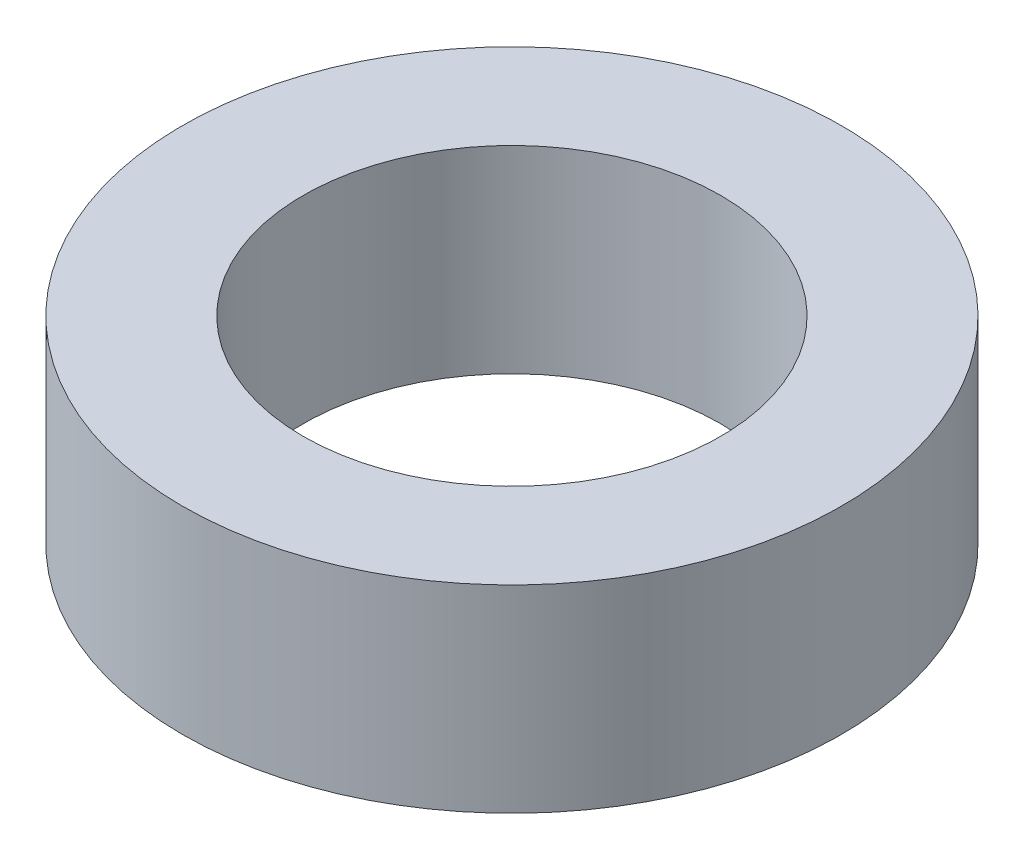
ISO-10303-21;
HEADER;
FILE_DESCRIPTION(('STEP AP214'),'2;1');
FILE_NAME('part.step','',(''),(''),'','','');
FILE_SCHEMA(('AUTOMOTIVE_DESIGN { 1 0 10303 214 1 1 1 1 }'));
ENDSEC;
DATA;
#1=APPLICATION_CONTEXT('core data for automotive mechanical design processes');
#2=APPLICATION_PROTOCOL_DEFINITION('international standard','automotive_design',2000,#1);
#3=PRODUCT_CONTEXT('',#1,'mechanical');
#4=PRODUCT('Part','Part','',(#3));
#5=PRODUCT_RELATED_PRODUCT_CATEGORY('part','',(#4));
#6=PRODUCT_DEFINITION_FORMATION('','',#4);
#7=PRODUCT_DEFINITION_CONTEXT('part definition',#1,'design');
#8=PRODUCT_DEFINITION('design','',#6,#7);
#9=PRODUCT_DEFINITION_SHAPE('','',#8);
#10=(LENGTH_UNIT() NAMED_UNIT(*) SI_UNIT(.MILLI.,.METRE.));
#11=(NAMED_UNIT(*) PLANE_ANGLE_UNIT() SI_UNIT($,.RADIAN.));
#12=(NAMED_UNIT(*) SI_UNIT($,.STERADIAN.) SOLID_ANGLE_UNIT());
#13=UNCERTAINTY_MEASURE_WITH_UNIT(LENGTH_MEASURE(1.E-05),#10,'distance_accuracy_value','');
#14=(GEOMETRIC_REPRESENTATION_CONTEXT(3) GLOBAL_UNCERTAINTY_ASSIGNED_CONTEXT((#13)) GLOBAL_UNIT_ASSIGNED_CONTEXT((#10,
#11,#12)) REPRESENTATION_CONTEXT('',''));
#15=CARTESIAN_POINT('',(0.,0.,0.));
#16=DIRECTION('',(0.,0.,1.));
#17=DIRECTION('',(1.,0.,0.));
#18=AXIS2_PLACEMENT_3D('',#15,#16,#17);
#19=CARTESIAN_POINT('',(0.,9.,0.));
#20=DIRECTION('',(0.,-1.,0.));
#21=DIRECTION('',(0.,0.,-1.));
#22=AXIS2_PLACEMENT_3D('',#19,#20,#21);
#23=CYLINDRICAL_SURFACE('',#22,15.);
#24=CARTESIAN_POINT('',(0.,9.,0.));
#25=DIRECTION('',(0.,1.,0.));
#26=DIRECTION('',(0.,0.,1.));
#27=AXIS2_PLACEMENT_3D('',#24,#25,#26);
#28=CIRCLE('',#27,15.);
#29=CARTESIAN_POINT('',(0.,9.,15.));
#30=VERTEX_POINT('',#29);
#31=EDGE_CURVE('E10',#30,#30,#28,.T.);
#32=ORIENTED_EDGE('',*,*,#31,.F.);
#33=EDGE_LOOP('',(#32));
#34=FACE_BOUND('',#33,.T.);
#35=CARTESIAN_POINT('',(0.,0.,0.));
#36=DIRECTION('',(0.,1.,0.));
#37=DIRECTION('',(0.,0.,1.));
#38=AXIS2_PLACEMENT_3D('',#35,#36,#37);
#39=CIRCLE('',#38,15.);
#40=CARTESIAN_POINT('',(0.,0.,15.));
#41=VERTEX_POINT('',#40);
#42=EDGE_CURVE('E36',#41,#41,#39,.T.);
#43=ORIENTED_EDGE('',*,*,#42,.T.);
#44=EDGE_LOOP('',(#43));
#45=FACE_BOUND('',#44,.T.);
#46=ADVANCED_FACE('F33',(#34,#45),#23,.T.);
#47=CARTESIAN_POINT('',(0.,9.,0.));
#48=DIRECTION('',(0.,1.,0.));
#49=DIRECTION('',(0.,0.,1.));
#50=AXIS2_PLACEMENT_3D('',#47,#48,#49);
#51=PLANE('',#50);
#52=CARTESIAN_POINT('',(0.,9.,0.));
#53=DIRECTION('',(0.,1.,0.));
#54=DIRECTION('',(0.,0.,1.));
#55=AXIS2_PLACEMENT_3D('',#52,#53,#54);
#56=CIRCLE('',#55,9.5);
#57=CARTESIAN_POINT('',(0.,9.,9.5));
#58=VERTEX_POINT('',#57);
#59=EDGE_CURVE('E45',#58,#58,#56,.T.);
#60=ORIENTED_EDGE('',*,*,#59,.F.);
#61=EDGE_LOOP('',(#60));
#62=FACE_BOUND('',#61,.T.);
#63=ORIENTED_EDGE('',*,*,#31,.T.);
#64=EDGE_LOOP('',(#63));
#65=FACE_BOUND('',#64,.T.);
#66=ADVANCED_FACE('F60',(#62,#65),#51,.T.);
#67=CARTESIAN_POINT('',(0.,0.,0.));
#68=DIRECTION('',(0.,1.,0.));
#69=DIRECTION('',(0.,0.,1.));
#70=AXIS2_PLACEMENT_3D('',#67,#68,#69);
#71=PLANE('',#70);
#72=CARTESIAN_POINT('',(0.,0.,0.));
#73=DIRECTION('',(0.,1.,0.));
#74=DIRECTION('',(0.,0.,1.));
#75=AXIS2_PLACEMENT_3D('',#72,#73,#74);
#76=CIRCLE('',#75,9.5);
#77=CARTESIAN_POINT('',(0.,0.,9.5));
#78=VERTEX_POINT('',#77);
#79=EDGE_CURVE('E43',#78,#78,#76,.T.);
#80=ORIENTED_EDGE('',*,*,#79,.T.);
#81=EDGE_LOOP('',(#80));
#82=FACE_BOUND('',#81,.T.);
#83=ORIENTED_EDGE('',*,*,#42,.F.);
#84=EDGE_LOOP('',(#83));
#85=FACE_BOUND('',#84,.T.);
#86=ADVANCED_FACE('F51',(#82,#85),#71,.F.);
#87=CARTESIAN_POINT('',(0.,0.,0.));
#88=DIRECTION('',(0.,1.,0.));
#89=DIRECTION('',(0.,0.,1.));
#90=AXIS2_PLACEMENT_3D('',#87,#88,#89);
#91=CYLINDRICAL_SURFACE('',#90,9.5);
#92=ORIENTED_EDGE('',*,*,#79,.F.);
#93=EDGE_LOOP('',(#92));
#94=FACE_BOUND('',#93,.T.);
#95=ORIENTED_EDGE('',*,*,#59,.T.);
#96=EDGE_LOOP('',(#95));
#97=FACE_BOUND('',#96,.T.);
#98=ADVANCED_FACE('F54',(#94,#97),#91,.F.);
#99=CLOSED_SHELL('',(#46,#66,#86,#98));
#100=MANIFOLD_SOLID_BREP('B2',#99);
#101=ADVANCED_BREP_SHAPE_REPRESENTATION('',(#18,#100),#14);
#102=SHAPE_DEFINITION_REPRESENTATION(#9,#101);
ENDSEC;
END-ISO-10303-21;
